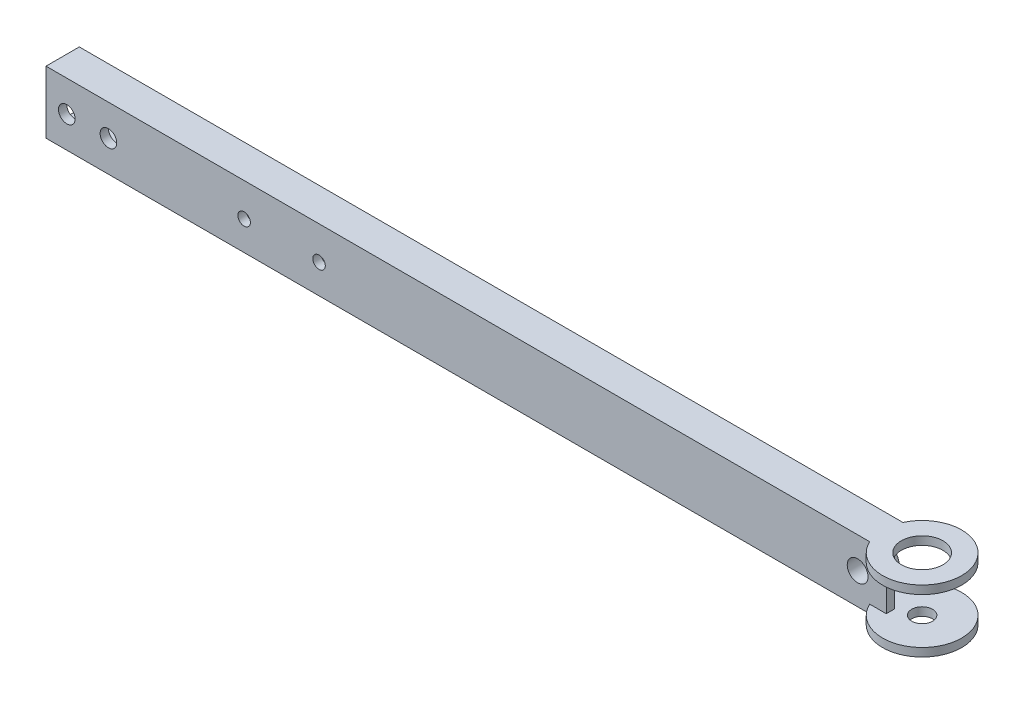
ISO-10303-21;
HEADER;
FILE_DESCRIPTION(('STEP AP214'),'2;1');
FILE_NAME('part.step','',(''),(''),'','','');
FILE_SCHEMA(('AUTOMOTIVE_DESIGN { 1 0 10303 214 1 1 1 1 }'));
ENDSEC;
DATA;
#1=APPLICATION_CONTEXT('core data for automotive mechanical design processes');
#2=APPLICATION_PROTOCOL_DEFINITION('international standard','automotive_design',2000,#1);
#3=PRODUCT_CONTEXT('',#1,'mechanical');
#4=PRODUCT('Part','Part','',(#3));
#5=PRODUCT_RELATED_PRODUCT_CATEGORY('part','',(#4));
#6=PRODUCT_DEFINITION_FORMATION('','',#4);
#7=PRODUCT_DEFINITION_CONTEXT('part definition',#1,'design');
#8=PRODUCT_DEFINITION('design','',#6,#7);
#9=PRODUCT_DEFINITION_SHAPE('','',#8);
#10=(LENGTH_UNIT() NAMED_UNIT(*) SI_UNIT(.MILLI.,.METRE.));
#11=(NAMED_UNIT(*) PLANE_ANGLE_UNIT() SI_UNIT($,.RADIAN.));
#12=(NAMED_UNIT(*) SI_UNIT($,.STERADIAN.) SOLID_ANGLE_UNIT());
#13=UNCERTAINTY_MEASURE_WITH_UNIT(LENGTH_MEASURE(1.E-05),#10,'distance_accuracy_value','');
#14=(GEOMETRIC_REPRESENTATION_CONTEXT(3) GLOBAL_UNCERTAINTY_ASSIGNED_CONTEXT((#13)) GLOBAL_UNIT_ASSIGNED_CONTEXT((#10,
#11,#12)) REPRESENTATION_CONTEXT('',''));
#15=CARTESIAN_POINT('',(0.,0.,0.));
#16=DIRECTION('',(0.,0.,1.));
#17=DIRECTION('',(1.,0.,0.));
#18=AXIS2_PLACEMENT_3D('',#15,#16,#17);
#19=CARTESIAN_POINT('',(0.,2.,0.));
#20=DIRECTION('',(0.,1.,0.));
#21=DIRECTION('',(0.,0.,1.));
#22=AXIS2_PLACEMENT_3D('',#19,#20,#21);
#23=PLANE('',#22);
#24=CARTESIAN_POINT('',(-192.,2.,0.));
#25=DIRECTION('',(0.,-1.,0.));
#26=DIRECTION('',(0.,0.,-1.));
#27=AXIS2_PLACEMENT_3D('',#24,#25,#26);
#28=CIRCLE('',#27,1.45000000000001);
#29=CARTESIAN_POINT('',(-192.,2.,-1.45000000000001));
#30=VERTEX_POINT('',#29);
#31=EDGE_CURVE('E401',#30,#30,#28,.T.);
#32=ORIENTED_EDGE('',*,*,#31,.T.);
#33=EDGE_LOOP('',(#32));
#34=FACE_BOUND('',#33,.T.);
#35=CARTESIAN_POINT('',(-176.,2.,0.));
#36=DIRECTION('',(0.,-1.,0.));
#37=DIRECTION('',(0.,0.,-1.));
#38=AXIS2_PLACEMENT_3D('',#35,#36,#37);
#39=CIRCLE('',#38,1.45000000000001);
#40=CARTESIAN_POINT('',(-176.,2.,-1.45000000000001));
#41=VERTEX_POINT('',#40);
#42=EDGE_CURVE('E422',#41,#41,#39,.T.);
#43=ORIENTED_EDGE('',*,*,#42,.T.);
#44=EDGE_LOOP('',(#43));
#45=FACE_BOUND('',#44,.T.);
#46=CARTESIAN_POINT('',(0.,2.,0.));
#47=DIRECTION('',(0.,1.,0.));
#48=DIRECTION('',(0.,0.,1.));
#49=AXIS2_PLACEMENT_3D('',#46,#47,#48);
#50=CIRCLE('',#49,2.5);
#51=CARTESIAN_POINT('',(0.,2.,2.5));
#52=VERTEX_POINT('',#51);
#53=EDGE_CURVE('E216',#52,#52,#50,.T.);
#54=ORIENTED_EDGE('',*,*,#53,.F.);
#55=EDGE_LOOP('',(#54));
#56=FACE_BOUND('',#55,.T.);
#57=DIRECTION('',(0.,0.,-1.));
#58=VECTOR('',#57,1.);
#59=CARTESIAN_POINT('',(-4.61684396980705,2.,4.));
#60=LINE('',#59,#58);
#61=CARTESIAN_POINT('',(-4.61684396980705,2.,4.));
#62=VERTEX_POINT('',#61);
#63=CARTESIAN_POINT('',(-4.61684396980705,2.,2.));
#64=VERTEX_POINT('',#63);
#65=EDGE_CURVE('E67',#62,#64,#60,.T.);
#66=ORIENTED_EDGE('',*,*,#65,.F.);
#67=DIRECTION('',(-1.,0.,0.));
#68=VECTOR('',#67,1.);
#69=CARTESIAN_POINT('',(-4.61684396980705,2.,4.));
#70=LINE('',#69,#68);
#71=CARTESIAN_POINT('',(-8.61684396980705,2.,4.));
#72=VERTEX_POINT('',#71);
#73=EDGE_CURVE('E137',#62,#72,#70,.T.);
#74=ORIENTED_EDGE('',*,*,#73,.T.);
#75=CARTESIAN_POINT('',(0.,2.,0.));
#76=DIRECTION('',(0.,1.,0.));
#77=DIRECTION('',(0.,0.,1.));
#78=AXIS2_PLACEMENT_3D('',#75,#76,#77);
#79=CIRCLE('',#78,9.5);
#80=CARTESIAN_POINT('',(-8.61684396980705,2.,-4.));
#81=VERTEX_POINT('',#80);
#82=EDGE_CURVE('E227',#72,#81,#79,.T.);
#83=ORIENTED_EDGE('',*,*,#82,.T.);
#84=DIRECTION('',(-1.,0.,0.));
#85=VECTOR('',#84,1.);
#86=CARTESIAN_POINT('',(-206.5,2.,-4.));
#87=LINE('',#86,#85);
#88=CARTESIAN_POINT('',(-206.5,2.,-4.));
#89=VERTEX_POINT('',#88);
#90=EDGE_CURVE('E231',#81,#89,#87,.T.);
#91=ORIENTED_EDGE('',*,*,#90,.T.);
#92=DIRECTION('',(0.,0.,1.));
#93=VECTOR('',#92,1.);
#94=CARTESIAN_POINT('',(-206.5,2.,-4.));
#95=LINE('',#94,#93);
#96=CARTESIAN_POINT('',(-206.5,2.,2.));
#97=VERTEX_POINT('',#96);
#98=EDGE_CURVE('E224',#89,#97,#95,.T.);
#99=ORIENTED_EDGE('',*,*,#98,.T.);
#100=DIRECTION('',(-1.,0.,0.));
#101=VECTOR('',#100,1.);
#102=CARTESIAN_POINT('',(-8.61684396980705,2.,2.));
#103=LINE('',#102,#101);
#104=EDGE_CURVE('E63',#64,#97,#103,.T.);
#105=ORIENTED_EDGE('',*,*,#104,.F.);
#106=EDGE_LOOP('',(#66,#74,#83,#91,#99,#105));
#107=FACE_BOUND('',#106,.T.);
#108=ADVANCED_FACE('F47',(#34,#45,#56,#107),#23,.T.);
#109=CARTESIAN_POINT('',(0.,13.,0.));
#110=DIRECTION('',(0.,-1.,0.));
#111=DIRECTION('',(0.,0.,-1.));
#112=AXIS2_PLACEMENT_3D('',#109,#110,#111);
#113=PLANE('',#112);
#114=CARTESIAN_POINT('',(0.,13.,0.));
#115=DIRECTION('',(0.,1.,0.));
#116=DIRECTION('',(0.,0.,1.));
#117=AXIS2_PLACEMENT_3D('',#114,#115,#116);
#118=CIRCLE('',#117,5.);
#119=CARTESIAN_POINT('',(0.,13.,5.));
#120=VERTEX_POINT('',#119);
#121=EDGE_CURVE('E136',#120,#120,#118,.T.);
#122=ORIENTED_EDGE('',*,*,#121,.T.);
#123=EDGE_LOOP('',(#122));
#124=FACE_BOUND('',#123,.T.);
#125=CARTESIAN_POINT('',(0.,13.,0.));
#126=DIRECTION('',(0.,1.,0.));
#127=DIRECTION('',(0.,0.,-1.));
#128=AXIS2_PLACEMENT_3D('',#125,#126,#127);
#129=CIRCLE('',#128,9.50000000000001);
#130=CARTESIAN_POINT('',(-8.61684396980705,13.,4.));
#131=VERTEX_POINT('',#130);
#132=CARTESIAN_POINT('',(-8.61684396980705,13.,-4.));
#133=VERTEX_POINT('',#132);
#134=EDGE_CURVE('E132',#131,#133,#129,.T.);
#135=ORIENTED_EDGE('',*,*,#134,.F.);
#136=DIRECTION('',(-1.,0.,0.));
#137=VECTOR('',#136,1.);
#138=CARTESIAN_POINT('',(-4.61684396980705,13.,4.));
#139=LINE('',#138,#137);
#140=CARTESIAN_POINT('',(-4.61684396980705,13.,4.));
#141=VERTEX_POINT('',#140);
#142=EDGE_CURVE('E124',#141,#131,#139,.T.);
#143=ORIENTED_EDGE('',*,*,#142,.F.);
#144=DIRECTION('',(0.,0.,1.));
#145=VECTOR('',#144,1.);
#146=CARTESIAN_POINT('',(-4.61684396980705,13.,2.));
#147=LINE('',#146,#145);
#148=CARTESIAN_POINT('',(-4.61684396980705,13.,2.));
#149=VERTEX_POINT('',#148);
#150=EDGE_CURVE('E129',#149,#141,#147,.T.);
#151=ORIENTED_EDGE('',*,*,#150,.F.);
#152=DIRECTION('',(-1.,0.,0.));
#153=VECTOR('',#152,1.);
#154=CARTESIAN_POINT('',(-8.61684396980705,13.,2.));
#155=LINE('',#154,#153);
#156=CARTESIAN_POINT('',(-206.5,13.,2.));
#157=VERTEX_POINT('',#156);
#158=EDGE_CURVE('E210',#149,#157,#155,.T.);
#159=ORIENTED_EDGE('',*,*,#158,.T.);
#160=DIRECTION('',(0.,0.,1.));
#161=VECTOR('',#160,1.);
#162=CARTESIAN_POINT('',(-206.5,13.,-4.));
#163=LINE('',#162,#161);
#164=CARTESIAN_POINT('',(-206.5,13.,-4.));
#165=VERTEX_POINT('',#164);
#166=EDGE_CURVE('E170',#165,#157,#163,.T.);
#167=ORIENTED_EDGE('',*,*,#166,.F.);
#168=DIRECTION('',(-1.,0.,0.));
#169=VECTOR('',#168,1.);
#170=CARTESIAN_POINT('',(-206.5,13.,-4.));
#171=LINE('',#170,#169);
#172=EDGE_CURVE('E179',#133,#165,#171,.T.);
#173=ORIENTED_EDGE('',*,*,#172,.F.);
#174=EDGE_LOOP('',(#135,#143,#151,#159,#167,#173));
#175=FACE_BOUND('',#174,.T.);
#176=ADVANCED_FACE('F126',(#124,#175),#113,.T.);
#177=CARTESIAN_POINT('',(0.,0.,0.));
#178=DIRECTION('',(0.,1.,0.));
#179=DIRECTION('',(0.,0.,1.));
#180=AXIS2_PLACEMENT_3D('',#177,#178,#179);
#181=PLANE('',#180);
#182=CARTESIAN_POINT('',(-192.,0.,0.));
#183=DIRECTION('',(0.,-1.,0.));
#184=DIRECTION('',(0.,0.,-1.));
#185=AXIS2_PLACEMENT_3D('',#182,#183,#184);
#186=CIRCLE('',#185,1.775);
#187=CARTESIAN_POINT('',(-192.,0.,-1.775));
#188=VERTEX_POINT('',#187);
#189=EDGE_CURVE('E406',#188,#188,#186,.T.);
#190=ORIENTED_EDGE('',*,*,#189,.F.);
#191=EDGE_LOOP('',(#190));
#192=FACE_BOUND('',#191,.T.);
#193=CARTESIAN_POINT('',(-176.,0.,0.));
#194=DIRECTION('',(0.,-1.,0.));
#195=DIRECTION('',(0.,0.,-1.));
#196=AXIS2_PLACEMENT_3D('',#193,#194,#195);
#197=CIRCLE('',#196,1.775);
#198=CARTESIAN_POINT('',(-176.,0.,-1.775));
#199=VERTEX_POINT('',#198);
#200=EDGE_CURVE('E410',#199,#199,#197,.T.);
#201=ORIENTED_EDGE('',*,*,#200,.F.);
#202=EDGE_LOOP('',(#201));
#203=FACE_BOUND('',#202,.T.);
#204=DIRECTION('',(0.,0.,1.));
#205=VECTOR('',#204,1.);
#206=CARTESIAN_POINT('',(-206.5,0.,-4.));
#207=LINE('',#206,#205);
#208=CARTESIAN_POINT('',(-206.5,0.,-4.));
#209=VERTEX_POINT('',#208);
#210=CARTESIAN_POINT('',(-206.5,0.,4.));
#211=VERTEX_POINT('',#210);
#212=EDGE_CURVE('E220',#209,#211,#207,.T.);
#213=ORIENTED_EDGE('',*,*,#212,.F.);
#214=DIRECTION('',(-1.,0.,0.));
#215=VECTOR('',#214,1.);
#216=CARTESIAN_POINT('',(-206.5,0.,-4.));
#217=LINE('',#216,#215);
#218=CARTESIAN_POINT('',(-8.61684396980705,0.,-4.));
#219=VERTEX_POINT('',#218);
#220=EDGE_CURVE('E228',#219,#209,#217,.T.);
#221=ORIENTED_EDGE('',*,*,#220,.F.);
#222=CARTESIAN_POINT('',(0.,0.,0.));
#223=DIRECTION('',(0.,1.,0.));
#224=DIRECTION('',(0.,0.,1.));
#225=AXIS2_PLACEMENT_3D('',#222,#223,#224);
#226=CIRCLE('',#225,9.5);
#227=CARTESIAN_POINT('',(-8.61684396980705,0.,4.));
#228=VERTEX_POINT('',#227);
#229=EDGE_CURVE('E241',#228,#219,#226,.T.);
#230=ORIENTED_EDGE('',*,*,#229,.F.);
#231=DIRECTION('',(1.,0.,0.));
#232=VECTOR('',#231,1.);
#233=CARTESIAN_POINT('',(-8.61684396980705,0.,4.));
#234=LINE('',#233,#232);
#235=EDGE_CURVE('E238',#211,#228,#234,.T.);
#236=ORIENTED_EDGE('',*,*,#235,.F.);
#237=EDGE_LOOP('',(#213,#221,#230,#236));
#238=FACE_BOUND('',#237,.T.);
#239=CARTESIAN_POINT('',(0.,0.,0.));
#240=DIRECTION('',(0.,1.,0.));
#241=DIRECTION('',(0.,0.,1.));
#242=AXIS2_PLACEMENT_3D('',#239,#240,#241);
#243=CIRCLE('',#242,2.5);
#244=CARTESIAN_POINT('',(0.,0.,2.5));
#245=VERTEX_POINT('',#244);
#246=EDGE_CURVE('E213',#245,#245,#243,.T.);
#247=ORIENTED_EDGE('',*,*,#246,.T.);
#248=EDGE_LOOP('',(#247));
#249=FACE_BOUND('',#248,.T.);
#250=ADVANCED_FACE('F285',(#192,#203,#238,#249),#181,.F.);
#251=CARTESIAN_POINT('',(-206.5,2.,-4.));
#252=DIRECTION('',(1.,0.,0.));
#253=DIRECTION('',(0.,0.,-1.));
#254=AXIS2_PLACEMENT_3D('',#251,#252,#253);
#255=PLANE('',#254);
#256=ORIENTED_EDGE('',*,*,#212,.T.);
#257=DIRECTION('',(0.,-1.,0.));
#258=VECTOR('',#257,1.);
#259=CARTESIAN_POINT('',(-206.5,2.,4.));
#260=LINE('',#259,#258);
#261=CARTESIAN_POINT('',(-206.5,15.,4.));
#262=VERTEX_POINT('',#261);
#263=EDGE_CURVE('E257',#262,#211,#260,.T.);
#264=ORIENTED_EDGE('',*,*,#263,.F.);
#265=DIRECTION('',(0.,0.,1.));
#266=VECTOR('',#265,1.);
#267=CARTESIAN_POINT('',(-206.5,15.,-4.));
#268=LINE('',#267,#266);
#269=CARTESIAN_POINT('',(-206.5,15.,-4.));
#270=VERTEX_POINT('',#269);
#271=EDGE_CURVE('E174',#270,#262,#268,.T.);
#272=ORIENTED_EDGE('',*,*,#271,.F.);
#273=DIRECTION('',(0.,-1.,0.));
#274=VECTOR('',#273,1.);
#275=CARTESIAN_POINT('',(-206.5,15.,-4.));
#276=LINE('',#275,#274);
#277=EDGE_CURVE('E188',#270,#165,#276,.T.);
#278=ORIENTED_EDGE('',*,*,#277,.T.);
#279=ORIENTED_EDGE('',*,*,#166,.T.);
#280=DIRECTION('',(0.,-1.,0.));
#281=VECTOR('',#280,1.);
#282=CARTESIAN_POINT('',(-206.5,2.,2.));
#283=LINE('',#282,#281);
#284=EDGE_CURVE('E206',#157,#97,#283,.T.);
#285=ORIENTED_EDGE('',*,*,#284,.T.);
#286=ORIENTED_EDGE('',*,*,#98,.F.);
#287=DIRECTION('',(0.,-1.,0.));
#288=VECTOR('',#287,1.);
#289=CARTESIAN_POINT('',(-206.5,2.,-4.));
#290=LINE('',#289,#288);
#291=EDGE_CURVE('E234',#89,#209,#290,.T.);
#292=ORIENTED_EDGE('',*,*,#291,.T.);
#293=EDGE_LOOP('',(#256,#264,#272,#278,#279,#285,#286,#292));
#294=FACE_BOUND('',#293,.T.);
#295=ADVANCED_FACE('F296',(#294),#255,.F.);
#296=CARTESIAN_POINT('',(-8.61684396980705,2.,4.));
#297=DIRECTION('',(0.,0.,-1.));
#298=DIRECTION('',(-1.,0.,0.));
#299=AXIS2_PLACEMENT_3D('',#296,#297,#298);
#300=PLANE('',#299);
#301=CARTESIAN_POINT('',(-11.5,7.5,4.));
#302=DIRECTION('',(0.,0.,-1.));
#303=DIRECTION('',(-1.,0.,0.));
#304=AXIS2_PLACEMENT_3D('',#301,#302,#303);
#305=CIRCLE('',#304,2.5);
#306=CARTESIAN_POINT('',(-14.,7.5,4.));
#307=VERTEX_POINT('',#306);
#308=EDGE_CURVE('E426',#307,#307,#305,.F.);
#309=ORIENTED_EDGE('',*,*,#308,.F.);
#310=EDGE_LOOP('',(#309));
#311=FACE_BOUND('',#310,.T.);
#312=CARTESIAN_POINT('',(-201.5,7.5,4.));
#313=DIRECTION('',(0.,0.,-1.));
#314=DIRECTION('',(-1.,0.,0.));
#315=AXIS2_PLACEMENT_3D('',#312,#313,#314);
#316=CIRCLE('',#315,2.);
#317=CARTESIAN_POINT('',(-203.5,7.5,4.));
#318=VERTEX_POINT('',#317);
#319=EDGE_CURVE('E150',#318,#318,#316,.F.);
#320=ORIENTED_EDGE('',*,*,#319,.F.);
#321=EDGE_LOOP('',(#320));
#322=FACE_BOUND('',#321,.T.);
#323=CARTESIAN_POINT('',(-191.5,7.5,4.));
#324=DIRECTION('',(0.,0.,-1.));
#325=DIRECTION('',(-1.,0.,0.));
#326=AXIS2_PLACEMENT_3D('',#323,#324,#325);
#327=CIRCLE('',#326,2.);
#328=CARTESIAN_POINT('',(-193.5,7.5,4.));
#329=VERTEX_POINT('',#328);
#330=EDGE_CURVE('E443',#329,#329,#327,.F.);
#331=ORIENTED_EDGE('',*,*,#330,.F.);
#332=EDGE_LOOP('',(#331));
#333=FACE_BOUND('',#332,.T.);
#334=CARTESIAN_POINT('',(-158.9,7.,4.));
#335=DIRECTION('',(0.,0.,-1.));
#336=DIRECTION('',(-1.,0.,0.));
#337=AXIS2_PLACEMENT_3D('',#334,#335,#336);
#338=CIRCLE('',#337,1.5);
#339=CARTESIAN_POINT('',(-160.4,7.,4.));
#340=VERTEX_POINT('',#339);
#341=EDGE_CURVE('E451',#340,#340,#338,.F.);
#342=ORIENTED_EDGE('',*,*,#341,.F.);
#343=EDGE_LOOP('',(#342));
#344=FACE_BOUND('',#343,.T.);
#345=CARTESIAN_POINT('',(-140.9,7.,4.));
#346=DIRECTION('',(0.,0.,-1.));
#347=DIRECTION('',(-1.,0.,0.));
#348=AXIS2_PLACEMENT_3D('',#345,#346,#347);
#349=CIRCLE('',#348,1.5);
#350=CARTESIAN_POINT('',(-142.4,7.,4.));
#351=VERTEX_POINT('',#350);
#352=EDGE_CURVE('E438',#351,#351,#349,.F.);
#353=ORIENTED_EDGE('',*,*,#352,.F.);
#354=EDGE_LOOP('',(#353));
#355=FACE_BOUND('',#354,.T.);
#356=ORIENTED_EDGE('',*,*,#235,.T.);
#357=DIRECTION('',(0.,-1.,0.));
#358=VECTOR('',#357,1.);
#359=CARTESIAN_POINT('',(-8.61684396980705,2.,4.));
#360=LINE('',#359,#358);
#361=EDGE_CURVE('E253',#72,#228,#360,.T.);
#362=ORIENTED_EDGE('',*,*,#361,.F.);
#363=ORIENTED_EDGE('',*,*,#73,.F.);
#364=DIRECTION('',(0.,-1.,0.));
#365=VECTOR('',#364,1.);
#366=CARTESIAN_POINT('',(-4.61684396980705,13.,4.));
#367=LINE('',#366,#365);
#368=EDGE_CURVE('E140',#141,#62,#367,.T.);
#369=ORIENTED_EDGE('',*,*,#368,.F.);
#370=ORIENTED_EDGE('',*,*,#142,.T.);
#371=DIRECTION('',(0.,-1.,0.));
#372=VECTOR('',#371,1.);
#373=CARTESIAN_POINT('',(-8.61684396980705,15.,4.));
#374=LINE('',#373,#372);
#375=CARTESIAN_POINT('',(-8.61684396980705,15.,4.));
#376=VERTEX_POINT('',#375);
#377=EDGE_CURVE('E203',#376,#131,#374,.T.);
#378=ORIENTED_EDGE('',*,*,#377,.F.);
#379=DIRECTION('',(1.,0.,0.));
#380=VECTOR('',#379,1.);
#381=CARTESIAN_POINT('',(-206.5,15.,4.));
#382=LINE('',#381,#380);
#383=EDGE_CURVE('E178',#262,#376,#382,.T.);
#384=ORIENTED_EDGE('',*,*,#383,.F.);
#385=ORIENTED_EDGE('',*,*,#263,.T.);
#386=EDGE_LOOP('',(#356,#362,#363,#369,#370,#378,#384,#385));
#387=FACE_BOUND('',#386,.T.);
#388=ADVANCED_FACE('F141',(#311,#322,#333,#344,#355,#387),#300,.F.);
#389=CARTESIAN_POINT('',(0.,2.,0.));
#390=DIRECTION('',(0.,-1.,0.));
#391=DIRECTION('',(0.,0.,-1.));
#392=AXIS2_PLACEMENT_3D('',#389,#390,#391);
#393=CYLINDRICAL_SURFACE('',#392,9.5);
#394=ORIENTED_EDGE('',*,*,#229,.T.);
#395=DIRECTION('',(0.,-1.,0.));
#396=VECTOR('',#395,1.);
#397=CARTESIAN_POINT('',(-8.61684396980705,2.,-4.));
#398=LINE('',#397,#396);
#399=EDGE_CURVE('E249',#81,#219,#398,.T.);
#400=ORIENTED_EDGE('',*,*,#399,.F.);
#401=ORIENTED_EDGE('',*,*,#82,.F.);
#402=ORIENTED_EDGE('',*,*,#361,.T.);
#403=EDGE_LOOP('',(#394,#400,#401,#402));
#404=FACE_BOUND('',#403,.T.);
#405=ADVANCED_FACE('F301',(#404),#393,.T.);
#406=CARTESIAN_POINT('',(-206.5,2.,-4.));
#407=DIRECTION('',(0.,0.,1.));
#408=DIRECTION('',(1.,0.,0.));
#409=AXIS2_PLACEMENT_3D('',#406,#407,#408);
#410=PLANE('',#409);
#411=ORIENTED_EDGE('',*,*,#220,.T.);
#412=ORIENTED_EDGE('',*,*,#291,.F.);
#413=ORIENTED_EDGE('',*,*,#90,.F.);
#414=ORIENTED_EDGE('',*,*,#399,.T.);
#415=EDGE_LOOP('',(#411,#412,#413,#414));
#416=FACE_BOUND('',#415,.T.);
#417=ADVANCED_FACE('F298',(#416),#410,.F.);
#418=CARTESIAN_POINT('',(0.,2.,0.));
#419=DIRECTION('',(0.,-1.,0.));
#420=DIRECTION('',(0.,0.,-1.));
#421=AXIS2_PLACEMENT_3D('',#418,#419,#420);
#422=CYLINDRICAL_SURFACE('',#421,2.5);
#423=ORIENTED_EDGE('',*,*,#53,.T.);
#424=EDGE_LOOP('',(#423));
#425=FACE_BOUND('',#424,.T.);
#426=ORIENTED_EDGE('',*,*,#246,.F.);
#427=EDGE_LOOP('',(#426));
#428=FACE_BOUND('',#427,.T.);
#429=ADVANCED_FACE('F292',(#425,#428),#422,.F.);
#430=CARTESIAN_POINT('',(-8.61684396980705,2.,2.));
#431=DIRECTION('',(0.,0.,-1.));
#432=DIRECTION('',(-1.,0.,0.));
#433=AXIS2_PLACEMENT_3D('',#430,#431,#432);
#434=PLANE('',#433);
#435=CARTESIAN_POINT('',(-11.5,7.5,2.));
#436=DIRECTION('',(0.,0.,-1.));
#437=DIRECTION('',(-1.,0.,0.));
#438=AXIS2_PLACEMENT_3D('',#435,#436,#437);
#439=CIRCLE('',#438,5.);
#440=CARTESIAN_POINT('',(-16.5,7.5,2.));
#441=VERTEX_POINT('',#440);
#442=EDGE_CURVE('E11',#441,#441,#439,.F.);
#443=ORIENTED_EDGE('',*,*,#442,.T.);
#444=EDGE_LOOP('',(#443));
#445=FACE_BOUND('',#444,.T.);
#446=CARTESIAN_POINT('',(-201.5,7.5,2.));
#447=DIRECTION('',(0.,0.,-1.));
#448=DIRECTION('',(-1.,0.,0.));
#449=AXIS2_PLACEMENT_3D('',#446,#447,#448);
#450=CIRCLE('',#449,2.);
#451=CARTESIAN_POINT('',(-203.5,7.5,2.));
#452=VERTEX_POINT('',#451);
#453=EDGE_CURVE('E154',#452,#452,#450,.T.);
#454=ORIENTED_EDGE('',*,*,#453,.F.);
#455=EDGE_LOOP('',(#454));
#456=FACE_BOUND('',#455,.T.);
#457=CARTESIAN_POINT('',(-191.5,7.5,2.));
#458=DIRECTION('',(0.,0.,-1.));
#459=DIRECTION('',(-1.,0.,0.));
#460=AXIS2_PLACEMENT_3D('',#457,#458,#459);
#461=CIRCLE('',#460,2.);
#462=CARTESIAN_POINT('',(-193.5,7.5,2.));
#463=VERTEX_POINT('',#462);
#464=EDGE_CURVE('E441',#463,#463,#461,.T.);
#465=ORIENTED_EDGE('',*,*,#464,.F.);
#466=EDGE_LOOP('',(#465));
#467=FACE_BOUND('',#466,.T.);
#468=CARTESIAN_POINT('',(-158.9,7.,2.));
#469=DIRECTION('',(0.,0.,-1.));
#470=DIRECTION('',(-1.,0.,0.));
#471=AXIS2_PLACEMENT_3D('',#468,#469,#470);
#472=CIRCLE('',#471,1.5);
#473=CARTESIAN_POINT('',(-160.4,7.,2.));
#474=VERTEX_POINT('',#473);
#475=EDGE_CURVE('E447',#474,#474,#472,.T.);
#476=ORIENTED_EDGE('',*,*,#475,.F.);
#477=EDGE_LOOP('',(#476));
#478=FACE_BOUND('',#477,.T.);
#479=CARTESIAN_POINT('',(-140.9,7.,2.));
#480=DIRECTION('',(0.,0.,-1.));
#481=DIRECTION('',(-1.,0.,0.));
#482=AXIS2_PLACEMENT_3D('',#479,#480,#481);
#483=CIRCLE('',#482,1.5);
#484=CARTESIAN_POINT('',(-142.4,7.,2.));
#485=VERTEX_POINT('',#484);
#486=EDGE_CURVE('E157',#485,#485,#483,.T.);
#487=ORIENTED_EDGE('',*,*,#486,.F.);
#488=EDGE_LOOP('',(#487));
#489=FACE_BOUND('',#488,.T.);
#490=ORIENTED_EDGE('',*,*,#284,.F.);
#491=ORIENTED_EDGE('',*,*,#158,.F.);
#492=DIRECTION('',(0.,1.,0.));
#493=VECTOR('',#492,1.);
#494=CARTESIAN_POINT('',(-4.61684396980705,2.,2.));
#495=LINE('',#494,#493);
#496=EDGE_CURVE('E148',#64,#149,#495,.T.);
#497=ORIENTED_EDGE('',*,*,#496,.F.);
#498=ORIENTED_EDGE('',*,*,#104,.T.);
#499=EDGE_LOOP('',(#490,#491,#497,#498));
#500=FACE_BOUND('',#499,.T.);
#501=ADVANCED_FACE('F332',(#445,#456,#467,#478,#489,#500),#434,.T.);
#502=CARTESIAN_POINT('',(0.,15.,0.));
#503=DIRECTION('',(0.,-1.,0.));
#504=DIRECTION('',(0.,0.,-1.));
#505=AXIS2_PLACEMENT_3D('',#502,#503,#504);
#506=PLANE('',#505);
#507=ORIENTED_EDGE('',*,*,#271,.T.);
#508=ORIENTED_EDGE('',*,*,#383,.T.);
#509=CARTESIAN_POINT('',(0.,15.,0.));
#510=DIRECTION('',(0.,1.,0.));
#511=DIRECTION('',(0.,0.,-1.));
#512=AXIS2_PLACEMENT_3D('',#509,#510,#511);
#513=CIRCLE('',#512,9.50000000000001);
#514=CARTESIAN_POINT('',(-8.61684396980705,15.,-4.));
#515=VERTEX_POINT('',#514);
#516=EDGE_CURVE('E182',#376,#515,#513,.T.);
#517=ORIENTED_EDGE('',*,*,#516,.T.);
#518=DIRECTION('',(-1.,0.,0.));
#519=VECTOR('',#518,1.);
#520=CARTESIAN_POINT('',(-206.5,15.,-4.));
#521=LINE('',#520,#519);
#522=EDGE_CURVE('E185',#515,#270,#521,.T.);
#523=ORIENTED_EDGE('',*,*,#522,.T.);
#524=EDGE_LOOP('',(#507,#508,#517,#523));
#525=FACE_BOUND('',#524,.T.);
#526=CARTESIAN_POINT('',(0.,15.,0.));
#527=DIRECTION('',(0.,1.,0.));
#528=DIRECTION('',(0.,0.,1.));
#529=AXIS2_PLACEMENT_3D('',#526,#527,#528);
#530=CIRCLE('',#529,5.);
#531=CARTESIAN_POINT('',(0.,15.,5.));
#532=VERTEX_POINT('',#531);
#533=EDGE_CURVE('E166',#532,#532,#530,.T.);
#534=ORIENTED_EDGE('',*,*,#533,.F.);
#535=EDGE_LOOP('',(#534));
#536=FACE_BOUND('',#535,.T.);
#537=ADVANCED_FACE('F325',(#525,#536),#506,.F.);
#538=CARTESIAN_POINT('',(0.,15.,0.));
#539=DIRECTION('',(0.,-1.,0.));
#540=DIRECTION('',(0.,0.,-1.));
#541=AXIS2_PLACEMENT_3D('',#538,#539,#540);
#542=CYLINDRICAL_SURFACE('',#541,9.50000000000001);
#543=ORIENTED_EDGE('',*,*,#134,.T.);
#544=DIRECTION('',(0.,-1.,0.));
#545=VECTOR('',#544,1.);
#546=CARTESIAN_POINT('',(-8.61684396980705,15.,-4.));
#547=LINE('',#546,#545);
#548=EDGE_CURVE('E199',#515,#133,#547,.T.);
#549=ORIENTED_EDGE('',*,*,#548,.F.);
#550=ORIENTED_EDGE('',*,*,#516,.F.);
#551=ORIENTED_EDGE('',*,*,#377,.T.);
#552=EDGE_LOOP('',(#543,#549,#550,#551));
#553=FACE_BOUND('',#552,.T.);
#554=ADVANCED_FACE('F343',(#553),#542,.T.);
#555=CARTESIAN_POINT('',(-206.5,15.,-4.));
#556=DIRECTION('',(0.,0.,1.));
#557=DIRECTION('',(1.,0.,0.));
#558=AXIS2_PLACEMENT_3D('',#555,#556,#557);
#559=PLANE('',#558);
#560=ORIENTED_EDGE('',*,*,#172,.T.);
#561=ORIENTED_EDGE('',*,*,#277,.F.);
#562=ORIENTED_EDGE('',*,*,#522,.F.);
#563=ORIENTED_EDGE('',*,*,#548,.T.);
#564=EDGE_LOOP('',(#560,#561,#562,#563));
#565=FACE_BOUND('',#564,.T.);
#566=ADVANCED_FACE('F351',(#565),#559,.F.);
#567=CARTESIAN_POINT('',(0.,15.,0.));
#568=DIRECTION('',(0.,-1.,0.));
#569=DIRECTION('',(0.,0.,-1.));
#570=AXIS2_PLACEMENT_3D('',#567,#568,#569);
#571=CYLINDRICAL_SURFACE('',#570,5.);
#572=ORIENTED_EDGE('',*,*,#533,.T.);
#573=EDGE_LOOP('',(#572));
#574=FACE_BOUND('',#573,.T.);
#575=ORIENTED_EDGE('',*,*,#121,.F.);
#576=EDGE_LOOP('',(#575));
#577=FACE_BOUND('',#576,.T.);
#578=ADVANCED_FACE('F354',(#574,#577),#571,.F.);
#579=CARTESIAN_POINT('',(-4.61684396980705,0.,0.));
#580=DIRECTION('',(1.,0.,0.));
#581=DIRECTION('',(0.,0.,-1.));
#582=AXIS2_PLACEMENT_3D('',#579,#580,#581);
#583=PLANE('',#582);
#584=ORIENTED_EDGE('',*,*,#150,.T.);
#585=ORIENTED_EDGE('',*,*,#368,.T.);
#586=ORIENTED_EDGE('',*,*,#65,.T.);
#587=ORIENTED_EDGE('',*,*,#496,.T.);
#588=EDGE_LOOP('',(#584,#585,#586,#587));
#589=FACE_BOUND('',#588,.T.);
#590=ADVANCED_FACE('F146',(#589),#583,.T.);
#591=CARTESIAN_POINT('',(-140.9,7.,9.501));
#592=DIRECTION('',(0.,0.,-1.));
#593=DIRECTION('',(-1.,0.,0.));
#594=AXIS2_PLACEMENT_3D('',#591,#592,#593);
#595=CYLINDRICAL_SURFACE('',#594,1.5);
#596=ORIENTED_EDGE('',*,*,#486,.T.);
#597=EDGE_LOOP('',(#596));
#598=FACE_BOUND('',#597,.T.);
#599=ORIENTED_EDGE('',*,*,#352,.T.);
#600=EDGE_LOOP('',(#599));
#601=FACE_BOUND('',#600,.T.);
#602=ADVANCED_FACE('F361',(#598,#601),#595,.F.);
#603=CARTESIAN_POINT('',(-158.9,7.,9.501));
#604=DIRECTION('',(0.,0.,-1.));
#605=DIRECTION('',(-1.,0.,0.));
#606=AXIS2_PLACEMENT_3D('',#603,#604,#605);
#607=CYLINDRICAL_SURFACE('',#606,1.5);
#608=ORIENTED_EDGE('',*,*,#475,.T.);
#609=EDGE_LOOP('',(#608));
#610=FACE_BOUND('',#609,.T.);
#611=ORIENTED_EDGE('',*,*,#341,.T.);
#612=EDGE_LOOP('',(#611));
#613=FACE_BOUND('',#612,.T.);
#614=ADVANCED_FACE('F364',(#610,#613),#607,.F.);
#615=CARTESIAN_POINT('',(-191.5,7.5,9.501));
#616=DIRECTION('',(0.,0.,-1.));
#617=DIRECTION('',(-1.,0.,0.));
#618=AXIS2_PLACEMENT_3D('',#615,#616,#617);
#619=CYLINDRICAL_SURFACE('',#618,2.);
#620=ORIENTED_EDGE('',*,*,#464,.T.);
#621=EDGE_LOOP('',(#620));
#622=FACE_BOUND('',#621,.T.);
#623=ORIENTED_EDGE('',*,*,#330,.T.);
#624=EDGE_LOOP('',(#623));
#625=FACE_BOUND('',#624,.T.);
#626=ADVANCED_FACE('F368',(#622,#625),#619,.F.);
#627=CARTESIAN_POINT('',(-201.5,7.5,9.501));
#628=DIRECTION('',(0.,0.,-1.));
#629=DIRECTION('',(-1.,0.,0.));
#630=AXIS2_PLACEMENT_3D('',#627,#628,#629);
#631=CYLINDRICAL_SURFACE('',#630,2.);
#632=ORIENTED_EDGE('',*,*,#453,.T.);
#633=EDGE_LOOP('',(#632));
#634=FACE_BOUND('',#633,.T.);
#635=ORIENTED_EDGE('',*,*,#319,.T.);
#636=EDGE_LOOP('',(#635));
#637=FACE_BOUND('',#636,.T.);
#638=ADVANCED_FACE('F372',(#634,#637),#631,.F.);
#639=CARTESIAN_POINT('',(-11.5,7.5,-2.));
#640=DIRECTION('',(0.,0.,-1.));
#641=DIRECTION('',(-1.,0.,0.));
#642=AXIS2_PLACEMENT_3D('',#639,#640,#641);
#643=PLANE('',#642);
#644=CARTESIAN_POINT('',(-11.5,7.5,-2.));
#645=DIRECTION('',(0.,0.,-1.));
#646=DIRECTION('',(-1.,0.,0.));
#647=AXIS2_PLACEMENT_3D('',#644,#645,#646);
#648=CIRCLE('',#647,4.);
#649=CARTESIAN_POINT('',(-15.5,7.5,-2.));
#650=VERTEX_POINT('',#649);
#651=EDGE_CURVE('E434',#650,#650,#648,.T.);
#652=ORIENTED_EDGE('',*,*,#651,.T.);
#653=EDGE_LOOP('',(#652));
#654=FACE_BOUND('',#653,.T.);
#655=CARTESIAN_POINT('',(-11.5,7.5,-2.));
#656=DIRECTION('',(0.,0.,-1.));
#657=DIRECTION('',(-1.,0.,0.));
#658=AXIS2_PLACEMENT_3D('',#655,#656,#657);
#659=CIRCLE('',#658,2.5);
#660=CARTESIAN_POINT('',(-14.,7.5,-2.));
#661=VERTEX_POINT('',#660);
#662=EDGE_CURVE('E430',#661,#661,#659,.T.);
#663=ORIENTED_EDGE('',*,*,#662,.F.);
#664=EDGE_LOOP('',(#663));
#665=FACE_BOUND('',#664,.T.);
#666=ADVANCED_FACE('F376',(#654,#665),#643,.T.);
#667=CARTESIAN_POINT('',(-11.5,7.5,-2.));
#668=DIRECTION('',(0.,0.,1.));
#669=DIRECTION('',(1.,0.,0.));
#670=AXIS2_PLACEMENT_3D('',#667,#668,#669);
#671=CYLINDRICAL_SURFACE('',#670,4.);
#672=CARTESIAN_POINT('',(-11.5,7.5,1.));
#673=DIRECTION('',(0.,0.,-1.));
#674=DIRECTION('',(-1.,0.,0.));
#675=AXIS2_PLACEMENT_3D('',#672,#673,#674);
#676=CIRCLE('',#675,4.);
#677=CARTESIAN_POINT('',(-15.5,7.5,1.));
#678=VERTEX_POINT('',#677);
#679=EDGE_CURVE('E56',#678,#678,#676,.T.);
#680=ORIENTED_EDGE('',*,*,#679,.T.);
#681=EDGE_LOOP('',(#680));
#682=FACE_BOUND('',#681,.T.);
#683=ORIENTED_EDGE('',*,*,#651,.F.);
#684=EDGE_LOOP('',(#683));
#685=FACE_BOUND('',#684,.T.);
#686=ADVANCED_FACE('F264',(#682,#685),#671,.T.);
#687=CARTESIAN_POINT('',(-11.5,7.5,-2.));
#688=DIRECTION('',(0.,0.,1.));
#689=DIRECTION('',(1.,0.,0.));
#690=AXIS2_PLACEMENT_3D('',#687,#688,#689);
#691=CYLINDRICAL_SURFACE('',#690,2.5);
#692=ORIENTED_EDGE('',*,*,#662,.T.);
#693=EDGE_LOOP('',(#692));
#694=FACE_BOUND('',#693,.T.);
#695=ORIENTED_EDGE('',*,*,#308,.T.);
#696=EDGE_LOOP('',(#695));
#697=FACE_BOUND('',#696,.T.);
#698=ADVANCED_FACE('F380',(#694,#697),#691,.F.);
#699=CARTESIAN_POINT('',(-176.,0.,0.));
#700=DIRECTION('',(0.,-1.,0.));
#701=DIRECTION('',(0.,0.,-1.));
#702=AXIS2_PLACEMENT_3D('',#699,#700,#701);
#703=CYLINDRICAL_SURFACE('',#702,1.45000000000001);
#704=ORIENTED_EDGE('',*,*,#42,.F.);
#705=EDGE_LOOP('',(#704));
#706=FACE_BOUND('',#705,.T.);
#707=CARTESIAN_POINT('',(-176.,0.325000000000002,0.));
#708=DIRECTION('',(0.,-1.,0.));
#709=DIRECTION('',(0.,0.,-1.));
#710=AXIS2_PLACEMENT_3D('',#707,#708,#709);
#711=CIRCLE('',#710,1.45000000000001);
#712=CARTESIAN_POINT('',(-176.,0.325000000000002,-1.45000000000001));
#713=VERTEX_POINT('',#712);
#714=EDGE_CURVE('E418',#713,#713,#711,.T.);
#715=ORIENTED_EDGE('',*,*,#714,.T.);
#716=EDGE_LOOP('',(#715));
#717=FACE_BOUND('',#716,.T.);
#718=ADVANCED_FACE('F386',(#706,#717),#703,.F.);
#719=CARTESIAN_POINT('',(-176.,0.,0.));
#720=DIRECTION('',(0.,-1.,0.));
#721=DIRECTION('',(0.,0.,-1.));
#722=AXIS2_PLACEMENT_3D('',#719,#720,#721);
#723=CONICAL_SURFACE('',#722,1.775,0.78539816339743);
#724=ORIENTED_EDGE('',*,*,#714,.F.);
#725=EDGE_LOOP('',(#724));
#726=FACE_BOUND('',#725,.T.);
#727=ORIENTED_EDGE('',*,*,#200,.T.);
#728=EDGE_LOOP('',(#727));
#729=FACE_BOUND('',#728,.T.);
#730=ADVANCED_FACE('F390',(#726,#729),#723,.F.);
#731=CARTESIAN_POINT('',(-192.,0.,0.));
#732=DIRECTION('',(0.,-1.,0.));
#733=DIRECTION('',(0.,0.,-1.));
#734=AXIS2_PLACEMENT_3D('',#731,#732,#733);
#735=CYLINDRICAL_SURFACE('',#734,1.45000000000001);
#736=ORIENTED_EDGE('',*,*,#31,.F.);
#737=EDGE_LOOP('',(#736));
#738=FACE_BOUND('',#737,.T.);
#739=CARTESIAN_POINT('',(-192.,0.325000000000002,0.));
#740=DIRECTION('',(0.,-1.,0.));
#741=DIRECTION('',(0.,0.,-1.));
#742=AXIS2_PLACEMENT_3D('',#739,#740,#741);
#743=CIRCLE('',#742,1.45000000000001);
#744=CARTESIAN_POINT('',(-192.,0.325000000000002,-1.45000000000001));
#745=VERTEX_POINT('',#744);
#746=EDGE_CURVE('E404',#745,#745,#743,.T.);
#747=ORIENTED_EDGE('',*,*,#746,.T.);
#748=EDGE_LOOP('',(#747));
#749=FACE_BOUND('',#748,.T.);
#750=ADVANCED_FACE('F273',(#738,#749),#735,.F.);
#751=CARTESIAN_POINT('',(-192.,0.,0.));
#752=DIRECTION('',(0.,-1.,0.));
#753=DIRECTION('',(0.,0.,-1.));
#754=AXIS2_PLACEMENT_3D('',#751,#752,#753);
#755=CONICAL_SURFACE('',#754,1.775,0.78539816339743);
#756=ORIENTED_EDGE('',*,*,#746,.F.);
#757=EDGE_LOOP('',(#756));
#758=FACE_BOUND('',#757,.T.);
#759=ORIENTED_EDGE('',*,*,#189,.T.);
#760=EDGE_LOOP('',(#759));
#761=FACE_BOUND('',#760,.T.);
#762=ADVANCED_FACE('F268',(#758,#761),#755,.F.);
#763=CARTESIAN_POINT('',(-11.5,7.5,1.));
#764=DIRECTION('',(0.,0.,-1.));
#765=DIRECTION('',(-1.,0.,0.));
#766=AXIS2_PLACEMENT_3D('',#763,#764,#765);
#767=TOROIDAL_SURFACE('',#766,5.,1.);
#768=ORIENTED_EDGE('',*,*,#442,.F.);
#769=EDGE_LOOP('',(#768));
#770=FACE_BOUND('',#769,.T.);
#771=ORIENTED_EDGE('',*,*,#679,.F.);
#772=EDGE_LOOP('',(#771));
#773=FACE_BOUND('',#772,.T.);
#774=ADVANCED_FACE('F49',(#770,#773),#767,.F.);
#775=CLOSED_SHELL('',(#108,#176,#250,#295,#388,#405,#417,#429,#501,#537,#554,#566,#578,#590,
#602,#614,#626,#638,#666,#686,#698,#718,#730,#750,#762,#774));
#776=MANIFOLD_SOLID_BREP('B2',#775);
#777=ADVANCED_BREP_SHAPE_REPRESENTATION('',(#18,#776),#14);
#778=SHAPE_DEFINITION_REPRESENTATION(#9,#777);
ENDSEC;
END-ISO-10303-21;
